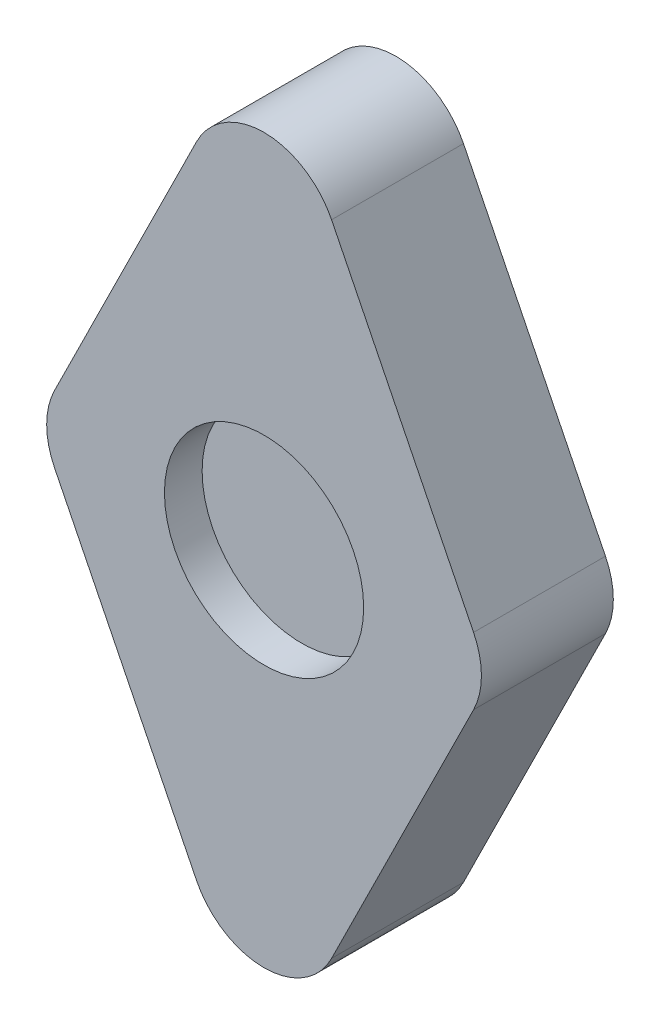
ISO-10303-21;
HEADER;
FILE_DESCRIPTION(('STEP AP214'),'2;1');
FILE_NAME('part.step','',(''),(''),'','','');
FILE_SCHEMA(('AUTOMOTIVE_DESIGN { 1 0 10303 214 1 1 1 1 }'));
ENDSEC;
DATA;
#1=APPLICATION_CONTEXT('core data for automotive mechanical design processes');
#2=APPLICATION_PROTOCOL_DEFINITION('international standard','automotive_design',2000,#1);
#3=PRODUCT_CONTEXT('',#1,'mechanical');
#4=PRODUCT('Part','Part','',(#3));
#5=PRODUCT_RELATED_PRODUCT_CATEGORY('part','',(#4));
#6=PRODUCT_DEFINITION_FORMATION('','',#4);
#7=PRODUCT_DEFINITION_CONTEXT('part definition',#1,'design');
#8=PRODUCT_DEFINITION('design','',#6,#7);
#9=PRODUCT_DEFINITION_SHAPE('','',#8);
#10=(LENGTH_UNIT() NAMED_UNIT(*) SI_UNIT(.MILLI.,.METRE.));
#11=(NAMED_UNIT(*) PLANE_ANGLE_UNIT() SI_UNIT($,.RADIAN.));
#12=(NAMED_UNIT(*) SI_UNIT($,.STERADIAN.) SOLID_ANGLE_UNIT());
#13=UNCERTAINTY_MEASURE_WITH_UNIT(LENGTH_MEASURE(1.E-05),#10,'distance_accuracy_value','');
#14=(GEOMETRIC_REPRESENTATION_CONTEXT(3) GLOBAL_UNCERTAINTY_ASSIGNED_CONTEXT((#13)) GLOBAL_UNIT_ASSIGNED_CONTEXT((#10,
#11,#12)) REPRESENTATION_CONTEXT('',''));
#15=CARTESIAN_POINT('',(0.,0.,0.));
#16=DIRECTION('',(0.,0.,1.));
#17=DIRECTION('',(1.,0.,0.));
#18=AXIS2_PLACEMENT_3D('',#15,#16,#17);
#19=CARTESIAN_POINT('',(0.,-115.793902900521,36.1659943273526));
#20=DIRECTION('',(0.,0.,-1.));
#21=DIRECTION('',(-1.,0.,0.));
#22=AXIS2_PLACEMENT_3D('',#19,#20,#21);
#23=CYLINDRICAL_SURFACE('',#22,30.48);
#24=CARTESIAN_POINT('',(0.,-115.793902900521,-17.1740056726474));
#25=DIRECTION('',(0.,0.,1.));
#26=DIRECTION('',(1.,0.,0.));
#27=AXIS2_PLACEMENT_3D('',#24,#25,#26);
#28=CIRCLE('',#27,30.48);
#29=CARTESIAN_POINT('',(-27.3071270731991,-129.334627069048,-17.1740056726474));
#30=VERTEX_POINT('',#29);
#31=CARTESIAN_POINT('',(27.3071270731991,-129.334627069048,-17.1740056726474));
#32=VERTEX_POINT('',#31);
#33=EDGE_CURVE('E142',#30,#32,#28,.T.);
#34=ORIENTED_EDGE('',*,*,#33,.T.);
#35=DIRECTION('',(0.,0.,-1.));
#36=VECTOR('',#35,1.);
#37=CARTESIAN_POINT('',(27.3071270731991,-129.334627069048,36.1659943273526));
#38=LINE('',#37,#36);
#39=CARTESIAN_POINT('',(27.3071270731991,-129.334627069048,36.1659943273526));
#40=VERTEX_POINT('',#39);
#41=EDGE_CURVE('E11',#40,#32,#38,.T.);
#42=ORIENTED_EDGE('',*,*,#41,.F.);
#43=CARTESIAN_POINT('',(0.,-115.793902900521,36.1659943273526));
#44=DIRECTION('',(0.,0.,1.));
#45=DIRECTION('',(1.,0.,0.));
#46=AXIS2_PLACEMENT_3D('',#43,#44,#45);
#47=CIRCLE('',#46,30.48);
#48=CARTESIAN_POINT('',(-27.3071270731991,-129.334627069048,36.1659943273526));
#49=VERTEX_POINT('',#48);
#50=EDGE_CURVE('E165',#49,#40,#47,.T.);
#51=ORIENTED_EDGE('',*,*,#50,.F.);
#52=DIRECTION('',(0.,0.,-1.));
#53=VECTOR('',#52,1.);
#54=CARTESIAN_POINT('',(-27.3071270731991,-129.334627069048,36.1659943273526));
#55=LINE('',#54,#53);
#56=EDGE_CURVE('E138',#49,#30,#55,.T.);
#57=ORIENTED_EDGE('',*,*,#56,.T.);
#58=EDGE_LOOP('',(#34,#42,#51,#57));
#59=FACE_BOUND('',#58,.T.);
#60=ADVANCED_FACE('F41',(#59),#23,.T.);
#61=CARTESIAN_POINT('',(84.7255913213908,-13.5407241685285,36.1659943273526));
#62=DIRECTION('',(-0.895903119199438,0.444249480594763,0.));
#63=DIRECTION('',(-0.444249480594763,-0.895903119199439,0.));
#64=AXIS2_PLACEMENT_3D('',#61,#62,#63);
#65=PLANE('',#64);
#66=DIRECTION('',(0.444249480594763,0.895903119199439,0.));
#67=VECTOR('',#66,1.);
#68=CARTESIAN_POINT('',(84.7255913213908,-13.5407241685285,-17.1740056726474));
#69=LINE('',#68,#67);
#70=CARTESIAN_POINT('',(84.7255913213908,-13.5407241685285,-17.1740056726474));
#71=VERTEX_POINT('',#70);
#72=EDGE_CURVE('E146',#32,#71,#69,.T.);
#73=ORIENTED_EDGE('',*,*,#72,.T.);
#74=DIRECTION('',(0.,0.,-1.));
#75=VECTOR('',#74,1.);
#76=CARTESIAN_POINT('',(84.7255913213908,-13.5407241685285,36.1659943273526));
#77=LINE('',#76,#75);
#78=CARTESIAN_POINT('',(84.7255913213908,-13.5407241685285,36.1659943273526));
#79=VERTEX_POINT('',#78);
#80=EDGE_CURVE('E50',#79,#71,#77,.T.);
#81=ORIENTED_EDGE('',*,*,#80,.F.);
#82=DIRECTION('',(0.444249480594763,0.895903119199439,0.));
#83=VECTOR('',#82,1.);
#84=CARTESIAN_POINT('',(84.7255913213908,-13.5407241685285,36.1659943273526));
#85=LINE('',#84,#83);
#86=EDGE_CURVE('E101',#40,#79,#85,.T.);
#87=ORIENTED_EDGE('',*,*,#86,.F.);
#88=ORIENTED_EDGE('',*,*,#41,.T.);
#89=EDGE_LOOP('',(#73,#81,#87,#88));
#90=FACE_BOUND('',#89,.T.);
#91=ADVANCED_FACE('F263',(#90),#65,.F.);
#92=CARTESIAN_POINT('',(57.418464248192,0.,36.1659943273526));
#93=DIRECTION('',(0.,0.,-1.));
#94=DIRECTION('',(-1.,0.,0.));
#95=AXIS2_PLACEMENT_3D('',#92,#93,#94);
#96=CYLINDRICAL_SURFACE('',#95,30.48);
#97=CARTESIAN_POINT('',(57.418464248192,0.,-17.1740056726474));
#98=DIRECTION('',(0.,0.,1.));
#99=DIRECTION('',(-1.,0.,0.));
#100=AXIS2_PLACEMENT_3D('',#97,#98,#99);
#101=CIRCLE('',#100,30.48);
#102=CARTESIAN_POINT('',(84.7255913213908,13.5407241685285,-17.1740056726474));
#103=VERTEX_POINT('',#102);
#104=EDGE_CURVE('E150',#71,#103,#101,.T.);
#105=ORIENTED_EDGE('',*,*,#104,.T.);
#106=DIRECTION('',(0.,0.,-1.));
#107=VECTOR('',#106,1.);
#108=CARTESIAN_POINT('',(84.7255913213908,13.5407241685285,36.1659943273526));
#109=LINE('',#108,#107);
#110=CARTESIAN_POINT('',(84.7255913213908,13.5407241685285,36.1659943273526));
#111=VERTEX_POINT('',#110);
#112=EDGE_CURVE('E176',#111,#103,#109,.T.);
#113=ORIENTED_EDGE('',*,*,#112,.F.);
#114=CARTESIAN_POINT('',(57.418464248192,0.,36.1659943273526));
#115=DIRECTION('',(0.,0.,1.));
#116=DIRECTION('',(-1.,0.,0.));
#117=AXIS2_PLACEMENT_3D('',#114,#115,#116);
#118=CIRCLE('',#117,30.48);
#119=EDGE_CURVE('E186',#79,#111,#118,.T.);
#120=ORIENTED_EDGE('',*,*,#119,.F.);
#121=ORIENTED_EDGE('',*,*,#80,.T.);
#122=EDGE_LOOP('',(#105,#113,#120,#121));
#123=FACE_BOUND('',#122,.T.);
#124=ADVANCED_FACE('F184',(#123),#96,.T.);
#125=CARTESIAN_POINT('',(27.3071270731991,129.334627069048,36.1659943273526));
#126=DIRECTION('',(-0.895903119199438,-0.444249480594763,0.));
#127=DIRECTION('',(0.444249480594763,-0.895903119199439,0.));
#128=AXIS2_PLACEMENT_3D('',#125,#126,#127);
#129=PLANE('',#128);
#130=DIRECTION('',(-0.444249480594763,0.895903119199439,0.));
#131=VECTOR('',#130,1.);
#132=CARTESIAN_POINT('',(27.3071270731991,129.334627069048,-17.1740056726474));
#133=LINE('',#132,#131);
#134=CARTESIAN_POINT('',(27.3071270731991,129.334627069048,-17.1740056726474));
#135=VERTEX_POINT('',#134);
#136=EDGE_CURVE('E153',#103,#135,#133,.T.);
#137=ORIENTED_EDGE('',*,*,#136,.T.);
#138=DIRECTION('',(0.,0.,-1.));
#139=VECTOR('',#138,1.);
#140=CARTESIAN_POINT('',(27.3071270731991,129.334627069048,36.1659943273526));
#141=LINE('',#140,#139);
#142=CARTESIAN_POINT('',(27.3071270731991,129.334627069048,36.1659943273526));
#143=VERTEX_POINT('',#142);
#144=EDGE_CURVE('E172',#143,#135,#141,.T.);
#145=ORIENTED_EDGE('',*,*,#144,.F.);
#146=DIRECTION('',(-0.444249480594763,0.895903119199439,0.));
#147=VECTOR('',#146,1.);
#148=CARTESIAN_POINT('',(27.3071270731991,129.334627069048,36.1659943273526));
#149=LINE('',#148,#147);
#150=EDGE_CURVE('E199',#111,#143,#149,.T.);
#151=ORIENTED_EDGE('',*,*,#150,.F.);
#152=ORIENTED_EDGE('',*,*,#112,.T.);
#153=EDGE_LOOP('',(#137,#145,#151,#152));
#154=FACE_BOUND('',#153,.T.);
#155=ADVANCED_FACE('F194',(#154),#129,.F.);
#156=CARTESIAN_POINT('',(0.,115.793902900521,36.1659943273526));
#157=DIRECTION('',(0.,0.,-1.));
#158=DIRECTION('',(-1.,0.,0.));
#159=AXIS2_PLACEMENT_3D('',#156,#157,#158);
#160=CYLINDRICAL_SURFACE('',#159,30.48);
#161=CARTESIAN_POINT('',(0.,115.793902900521,-17.1740056726474));
#162=DIRECTION('',(0.,0.,1.));
#163=DIRECTION('',(-1.,0.,0.));
#164=AXIS2_PLACEMENT_3D('',#161,#162,#163);
#165=CIRCLE('',#164,30.48);
#166=CARTESIAN_POINT('',(-27.3071270731991,129.334627069048,-17.1740056726474));
#167=VERTEX_POINT('',#166);
#168=EDGE_CURVE('E156',#135,#167,#165,.T.);
#169=ORIENTED_EDGE('',*,*,#168,.T.);
#170=DIRECTION('',(0.,0.,-1.));
#171=VECTOR('',#170,1.);
#172=CARTESIAN_POINT('',(-27.3071270731991,129.334627069048,36.1659943273526));
#173=LINE('',#172,#171);
#174=CARTESIAN_POINT('',(-27.3071270731991,129.334627069048,36.1659943273526));
#175=VERTEX_POINT('',#174);
#176=EDGE_CURVE('E131',#175,#167,#173,.T.);
#177=ORIENTED_EDGE('',*,*,#176,.F.);
#178=CARTESIAN_POINT('',(0.,115.793902900521,36.1659943273526));
#179=DIRECTION('',(0.,0.,1.));
#180=DIRECTION('',(-1.,0.,0.));
#181=AXIS2_PLACEMENT_3D('',#178,#179,#180);
#182=CIRCLE('',#181,30.48);
#183=EDGE_CURVE('E120',#143,#175,#182,.T.);
#184=ORIENTED_EDGE('',*,*,#183,.F.);
#185=ORIENTED_EDGE('',*,*,#144,.T.);
#186=EDGE_LOOP('',(#169,#177,#184,#185));
#187=FACE_BOUND('',#186,.T.);
#188=ADVANCED_FACE('F197',(#187),#160,.T.);
#189=CARTESIAN_POINT('',(-84.7255913213908,13.5407241685285,36.1659943273526));
#190=DIRECTION('',(0.895903119199438,-0.444249480594763,0.));
#191=DIRECTION('',(0.444249480594763,0.895903119199439,0.));
#192=AXIS2_PLACEMENT_3D('',#189,#190,#191);
#193=PLANE('',#192);
#194=DIRECTION('',(-0.444249480594763,-0.895903119199439,0.));
#195=VECTOR('',#194,1.);
#196=CARTESIAN_POINT('',(-84.7255913213908,13.5407241685285,-17.1740056726474));
#197=LINE('',#196,#195);
#198=CARTESIAN_POINT('',(-84.7255913213908,13.5407241685285,-17.1740056726474));
#199=VERTEX_POINT('',#198);
#200=EDGE_CURVE('E129',#167,#199,#197,.T.);
#201=ORIENTED_EDGE('',*,*,#200,.T.);
#202=DIRECTION('',(0.,0.,-1.));
#203=VECTOR('',#202,1.);
#204=CARTESIAN_POINT('',(-84.7255913213908,13.5407241685285,36.1659943273526));
#205=LINE('',#204,#203);
#206=CARTESIAN_POINT('',(-84.7255913213908,13.5407241685285,36.1659943273526));
#207=VERTEX_POINT('',#206);
#208=EDGE_CURVE('E126',#207,#199,#205,.T.);
#209=ORIENTED_EDGE('',*,*,#208,.F.);
#210=DIRECTION('',(-0.444249480594763,-0.895903119199439,0.));
#211=VECTOR('',#210,1.);
#212=CARTESIAN_POINT('',(-84.7255913213908,13.5407241685285,36.1659943273526));
#213=LINE('',#212,#211);
#214=EDGE_CURVE('E114',#175,#207,#213,.T.);
#215=ORIENTED_EDGE('',*,*,#214,.F.);
#216=ORIENTED_EDGE('',*,*,#176,.T.);
#217=EDGE_LOOP('',(#201,#209,#215,#216));
#218=FACE_BOUND('',#217,.T.);
#219=ADVANCED_FACE('F127',(#218),#193,.F.);
#220=CARTESIAN_POINT('',(-57.418464248192,0.,36.1659943273526));
#221=DIRECTION('',(0.,0.,-1.));
#222=DIRECTION('',(-1.,0.,0.));
#223=AXIS2_PLACEMENT_3D('',#220,#221,#222);
#224=CYLINDRICAL_SURFACE('',#223,30.48);
#225=CARTESIAN_POINT('',(-57.418464248192,0.,-17.1740056726474));
#226=DIRECTION('',(0.,0.,1.));
#227=DIRECTION('',(1.,0.,0.));
#228=AXIS2_PLACEMENT_3D('',#225,#226,#227);
#229=CIRCLE('',#228,30.48);
#230=CARTESIAN_POINT('',(-84.7255913213908,-13.5407241685285,-17.1740056726474));
#231=VERTEX_POINT('',#230);
#232=EDGE_CURVE('E87',#199,#231,#229,.T.);
#233=ORIENTED_EDGE('',*,*,#232,.T.);
#234=DIRECTION('',(0.,0.,-1.));
#235=VECTOR('',#234,1.);
#236=CARTESIAN_POINT('',(-84.7255913213908,-13.5407241685285,36.1659943273526));
#237=LINE('',#236,#235);
#238=CARTESIAN_POINT('',(-84.7255913213908,-13.5407241685285,36.1659943273526));
#239=VERTEX_POINT('',#238);
#240=EDGE_CURVE('E132',#239,#231,#237,.T.);
#241=ORIENTED_EDGE('',*,*,#240,.F.);
#242=CARTESIAN_POINT('',(-57.418464248192,0.,36.1659943273526));
#243=DIRECTION('',(0.,0.,1.));
#244=DIRECTION('',(1.,0.,0.));
#245=AXIS2_PLACEMENT_3D('',#242,#243,#244);
#246=CIRCLE('',#245,30.48);
#247=EDGE_CURVE('E118',#207,#239,#246,.T.);
#248=ORIENTED_EDGE('',*,*,#247,.F.);
#249=ORIENTED_EDGE('',*,*,#208,.T.);
#250=EDGE_LOOP('',(#233,#241,#248,#249));
#251=FACE_BOUND('',#250,.T.);
#252=ADVANCED_FACE('F134',(#251),#224,.T.);
#253=CARTESIAN_POINT('',(-84.7255913213908,-13.5407241685285,36.1659943273526));
#254=DIRECTION('',(0.895903119199438,0.444249480594763,0.));
#255=DIRECTION('',(-0.444249480594763,0.895903119199439,0.));
#256=AXIS2_PLACEMENT_3D('',#253,#254,#255);
#257=PLANE('',#256);
#258=DIRECTION('',(0.444249480594763,-0.895903119199439,0.));
#259=VECTOR('',#258,1.);
#260=CARTESIAN_POINT('',(-84.7255913213908,-13.5407241685285,-17.1740056726474));
#261=LINE('',#260,#259);
#262=EDGE_CURVE('E93',#231,#30,#261,.T.);
#263=ORIENTED_EDGE('',*,*,#262,.T.);
#264=ORIENTED_EDGE('',*,*,#56,.F.);
#265=DIRECTION('',(0.444249480594763,-0.895903119199439,0.));
#266=VECTOR('',#265,1.);
#267=CARTESIAN_POINT('',(-84.7255913213908,-13.5407241685285,36.1659943273526));
#268=LINE('',#267,#266);
#269=EDGE_CURVE('E58',#239,#49,#268,.T.);
#270=ORIENTED_EDGE('',*,*,#269,.F.);
#271=ORIENTED_EDGE('',*,*,#240,.T.);
#272=EDGE_LOOP('',(#263,#264,#270,#271));
#273=FACE_BOUND('',#272,.T.);
#274=ADVANCED_FACE('F270',(#273),#257,.F.);
#275=CARTESIAN_POINT('',(0.,-115.793902900521,36.1659943273526));
#276=DIRECTION('',(0.,0.,1.));
#277=DIRECTION('',(1.,0.,0.));
#278=AXIS2_PLACEMENT_3D('',#275,#276,#277);
#279=PLANE('',#278);
#280=CARTESIAN_POINT('',(0.,0.,36.1659943273526));
#281=DIRECTION('',(0.,0.,1.));
#282=DIRECTION('',(1.,0.,0.));
#283=AXIS2_PLACEMENT_3D('',#280,#281,#282);
#284=CIRCLE('',#283,40.2780245441773);
#285=CARTESIAN_POINT('',(40.2780245441773,0.,36.1659943273526));
#286=VERTEX_POINT('',#285);
#287=EDGE_CURVE('E209',#286,#286,#284,.T.);
#288=ORIENTED_EDGE('',*,*,#287,.F.);
#289=EDGE_LOOP('',(#288));
#290=FACE_BOUND('',#289,.T.);
#291=ORIENTED_EDGE('',*,*,#50,.T.);
#292=ORIENTED_EDGE('',*,*,#86,.T.);
#293=ORIENTED_EDGE('',*,*,#119,.T.);
#294=ORIENTED_EDGE('',*,*,#150,.T.);
#295=ORIENTED_EDGE('',*,*,#183,.T.);
#296=ORIENTED_EDGE('',*,*,#214,.T.);
#297=ORIENTED_EDGE('',*,*,#247,.T.);
#298=ORIENTED_EDGE('',*,*,#269,.T.);
#299=EDGE_LOOP('',(#291,#292,#293,#294,#295,#296,#297,#298));
#300=FACE_BOUND('',#299,.T.);
#301=ADVANCED_FACE('F116',(#290,#300),#279,.T.);
#302=CARTESIAN_POINT('',(0.,-115.793902900521,-17.1740056726474));
#303=DIRECTION('',(0.,0.,1.));
#304=DIRECTION('',(1.,0.,0.));
#305=AXIS2_PLACEMENT_3D('',#302,#303,#304);
#306=PLANE('',#305);
#307=CARTESIAN_POINT('',(44.45,0.,-17.1740056726474));
#308=DIRECTION('',(0.,0.,-1.));
#309=DIRECTION('',(-1.,0.,0.));
#310=AXIS2_PLACEMENT_3D('',#307,#308,#309);
#311=CIRCLE('',#310,25.4);
#312=CARTESIAN_POINT('',(19.05,0.,-17.1740056726474));
#313=VERTEX_POINT('',#312);
#314=EDGE_CURVE('E225',#313,#313,#311,.T.);
#315=ORIENTED_EDGE('',*,*,#314,.F.);
#316=EDGE_LOOP('',(#315));
#317=FACE_BOUND('',#316,.T.);
#318=CARTESIAN_POINT('',(-44.45,0.,-17.1740056726474));
#319=DIRECTION('',(0.,0.,-1.));
#320=DIRECTION('',(-1.,0.,0.));
#321=AXIS2_PLACEMENT_3D('',#318,#319,#320);
#322=CIRCLE('',#321,25.4);
#323=CARTESIAN_POINT('',(-69.85,0.,-17.1740056726474));
#324=VERTEX_POINT('',#323);
#325=EDGE_CURVE('E217',#324,#324,#322,.T.);
#326=ORIENTED_EDGE('',*,*,#325,.F.);
#327=EDGE_LOOP('',(#326));
#328=FACE_BOUND('',#327,.T.);
#329=ORIENTED_EDGE('',*,*,#33,.F.);
#330=ORIENTED_EDGE('',*,*,#262,.F.);
#331=ORIENTED_EDGE('',*,*,#232,.F.);
#332=ORIENTED_EDGE('',*,*,#200,.F.);
#333=ORIENTED_EDGE('',*,*,#168,.F.);
#334=ORIENTED_EDGE('',*,*,#136,.F.);
#335=ORIENTED_EDGE('',*,*,#104,.F.);
#336=ORIENTED_EDGE('',*,*,#72,.F.);
#337=EDGE_LOOP('',(#329,#330,#331,#332,#333,#334,#335,#336));
#338=FACE_BOUND('',#337,.T.);
#339=ADVANCED_FACE('F190',(#317,#328,#338),#306,.F.);
#340=CARTESIAN_POINT('',(0.,0.,20.9259943273526));
#341=DIRECTION('',(0.,0.,1.));
#342=DIRECTION('',(1.,0.,0.));
#343=AXIS2_PLACEMENT_3D('',#340,#341,#342);
#344=CYLINDRICAL_SURFACE('',#343,40.2780245441773);
#345=CARTESIAN_POINT('',(0.,0.,20.9259943273526));
#346=DIRECTION('',(0.,0.,1.));
#347=DIRECTION('',(1.,0.,0.));
#348=AXIS2_PLACEMENT_3D('',#345,#346,#347);
#349=CIRCLE('',#348,40.2780245441773);
#350=CARTESIAN_POINT('',(40.2780245441773,0.,20.9259943273526));
#351=VERTEX_POINT('',#350);
#352=EDGE_CURVE('E147',#351,#351,#349,.T.);
#353=ORIENTED_EDGE('',*,*,#352,.F.);
#354=EDGE_LOOP('',(#353));
#355=FACE_BOUND('',#354,.T.);
#356=ORIENTED_EDGE('',*,*,#287,.T.);
#357=EDGE_LOOP('',(#356));
#358=FACE_BOUND('',#357,.T.);
#359=ADVANCED_FACE('F244',(#355,#358),#344,.F.);
#360=CARTESIAN_POINT('',(0.,0.,20.9259943273526));
#361=DIRECTION('',(0.,0.,1.));
#362=DIRECTION('',(1.,0.,0.));
#363=AXIS2_PLACEMENT_3D('',#360,#361,#362);
#364=PLANE('',#363);
#365=ORIENTED_EDGE('',*,*,#352,.T.);
#366=EDGE_LOOP('',(#365));
#367=FACE_BOUND('',#366,.T.);
#368=ADVANCED_FACE('F250',(#367),#364,.T.);
#369=CARTESIAN_POINT('',(-44.45,0.,-1.93400567264744));
#370=DIRECTION('',(0.,0.,-1.));
#371=DIRECTION('',(-1.,0.,0.));
#372=AXIS2_PLACEMENT_3D('',#369,#370,#371);
#373=CYLINDRICAL_SURFACE('',#372,25.4);
#374=CARTESIAN_POINT('',(-44.45,0.,-1.93400567264744));
#375=DIRECTION('',(0.,0.,-1.));
#376=DIRECTION('',(-1.,0.,0.));
#377=AXIS2_PLACEMENT_3D('',#374,#375,#376);
#378=CIRCLE('',#377,25.4);
#379=CARTESIAN_POINT('',(-69.85,0.,-1.93400567264744));
#380=VERTEX_POINT('',#379);
#381=EDGE_CURVE('E221',#380,#380,#378,.T.);
#382=ORIENTED_EDGE('',*,*,#381,.F.);
#383=EDGE_LOOP('',(#382));
#384=FACE_BOUND('',#383,.T.);
#385=ORIENTED_EDGE('',*,*,#325,.T.);
#386=EDGE_LOOP('',(#385));
#387=FACE_BOUND('',#386,.T.);
#388=ADVANCED_FACE('F248',(#384,#387),#373,.F.);
#389=CARTESIAN_POINT('',(-44.45,0.,-1.93400567264744));
#390=DIRECTION('',(0.,0.,-1.));
#391=DIRECTION('',(-1.,0.,0.));
#392=AXIS2_PLACEMENT_3D('',#389,#390,#391);
#393=PLANE('',#392);
#394=ORIENTED_EDGE('',*,*,#381,.T.);
#395=EDGE_LOOP('',(#394));
#396=FACE_BOUND('',#395,.T.);
#397=ADVANCED_FACE('F238',(#396),#393,.T.);
#398=CARTESIAN_POINT('',(44.45,0.,-1.93400567264744));
#399=DIRECTION('',(0.,0.,-1.));
#400=DIRECTION('',(-1.,0.,0.));
#401=AXIS2_PLACEMENT_3D('',#398,#399,#400);
#402=CYLINDRICAL_SURFACE('',#401,25.4);
#403=CARTESIAN_POINT('',(44.45,0.,-1.93400567264744));
#404=DIRECTION('',(0.,0.,-1.));
#405=DIRECTION('',(-1.,0.,0.));
#406=AXIS2_PLACEMENT_3D('',#403,#404,#405);
#407=CIRCLE('',#406,25.4);
#408=CARTESIAN_POINT('',(19.05,0.,-1.93400567264744));
#409=VERTEX_POINT('',#408);
#410=EDGE_CURVE('E213',#409,#409,#407,.T.);
#411=ORIENTED_EDGE('',*,*,#410,.F.);
#412=EDGE_LOOP('',(#411));
#413=FACE_BOUND('',#412,.T.);
#414=ORIENTED_EDGE('',*,*,#314,.T.);
#415=EDGE_LOOP('',(#414));
#416=FACE_BOUND('',#415,.T.);
#417=ADVANCED_FACE('F235',(#413,#416),#402,.F.);
#418=CARTESIAN_POINT('',(44.45,0.,-1.93400567264744));
#419=DIRECTION('',(0.,0.,-1.));
#420=DIRECTION('',(-1.,0.,0.));
#421=AXIS2_PLACEMENT_3D('',#418,#419,#420);
#422=PLANE('',#421);
#423=ORIENTED_EDGE('',*,*,#410,.T.);
#424=EDGE_LOOP('',(#423));
#425=FACE_BOUND('',#424,.T.);
#426=ADVANCED_FACE('F233',(#425),#422,.T.);
#427=CLOSED_SHELL('',(#60,#91,#124,#155,#188,#219,#252,#274,#301,#339,#359,#368,#388,#397,#417,#426));
#428=MANIFOLD_SOLID_BREP('B2',#427);
#429=ADVANCED_BREP_SHAPE_REPRESENTATION('',(#18,#428),#14);
#430=SHAPE_DEFINITION_REPRESENTATION(#9,#429);
ENDSEC;
END-ISO-10303-21;
